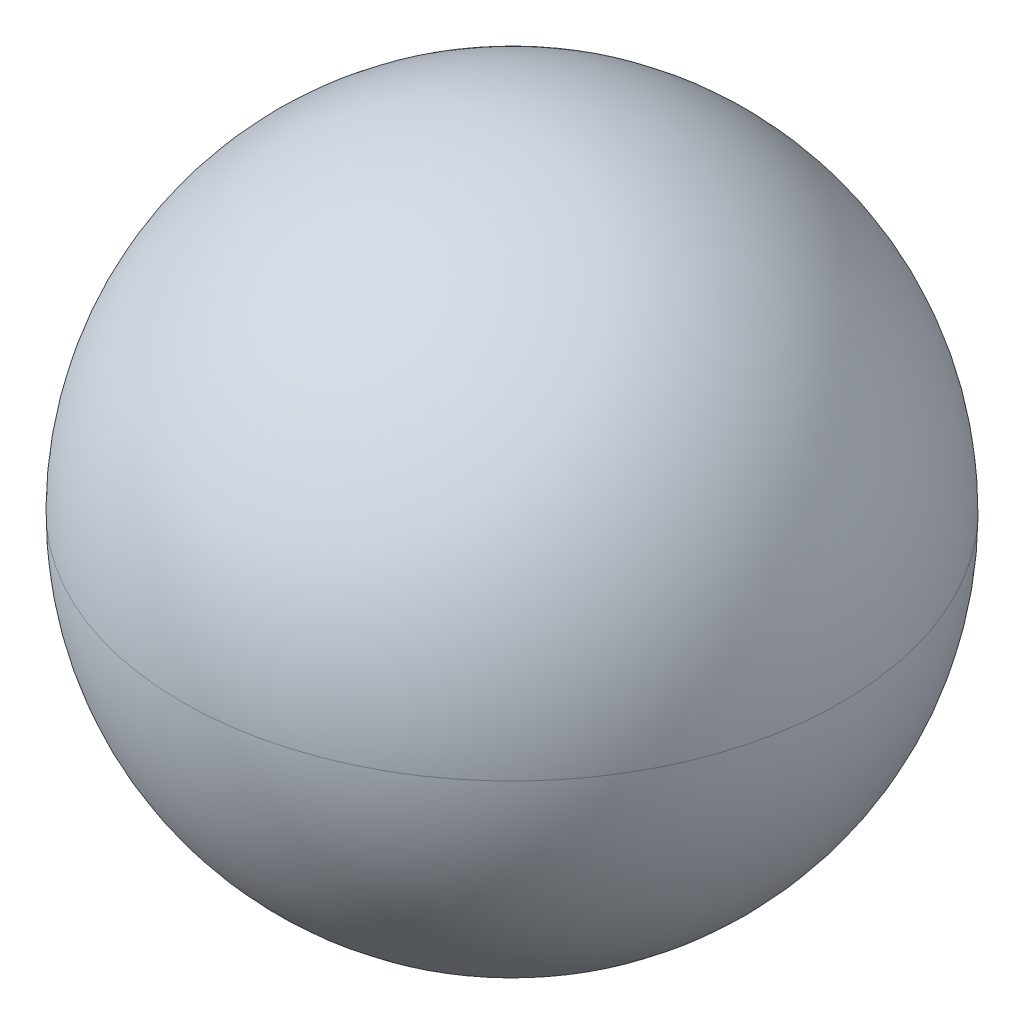
ISO-10303-21;
HEADER;
FILE_DESCRIPTION(('STEP AP214'),'2;1');
FILE_NAME('part.step','',(''),(''),'','','');
FILE_SCHEMA(('AUTOMOTIVE_DESIGN { 1 0 10303 214 1 1 1 1 }'));
ENDSEC;
DATA;
#1=APPLICATION_CONTEXT('core data for automotive mechanical design processes');
#2=APPLICATION_PROTOCOL_DEFINITION('international standard','automotive_design',2000,#1);
#3=PRODUCT_CONTEXT('',#1,'mechanical');
#4=PRODUCT('Part','Part','',(#3));
#5=PRODUCT_RELATED_PRODUCT_CATEGORY('part','',(#4));
#6=PRODUCT_DEFINITION_FORMATION('','',#4);
#7=PRODUCT_DEFINITION_CONTEXT('part definition',#1,'design');
#8=PRODUCT_DEFINITION('design','',#6,#7);
#9=PRODUCT_DEFINITION_SHAPE('','',#8);
#10=(LENGTH_UNIT() NAMED_UNIT(*) SI_UNIT(.MILLI.,.METRE.));
#11=(NAMED_UNIT(*) PLANE_ANGLE_UNIT() SI_UNIT($,.RADIAN.));
#12=(NAMED_UNIT(*) SI_UNIT($,.STERADIAN.) SOLID_ANGLE_UNIT());
#13=UNCERTAINTY_MEASURE_WITH_UNIT(LENGTH_MEASURE(1.E-05),#10,'distance_accuracy_value','');
#14=(GEOMETRIC_REPRESENTATION_CONTEXT(3) GLOBAL_UNCERTAINTY_ASSIGNED_CONTEXT((#13)) GLOBAL_UNIT_ASSIGNED_CONTEXT((#10,
#11,#12)) REPRESENTATION_CONTEXT('',''));
#15=CARTESIAN_POINT('',(0.,0.,0.));
#16=DIRECTION('',(0.,0.,1.));
#17=DIRECTION('',(1.,0.,0.));
#18=AXIS2_PLACEMENT_3D('',#15,#16,#17);
#19=CARTESIAN_POINT('',(0.,304.8,0.));
#20=DIRECTION('',(0.,1.,0.));
#21=DIRECTION('',(0.,0.,1.));
#22=AXIS2_PLACEMENT_3D('',#19,#20,#21);
#23=SPHERICAL_SURFACE('',#22,304.8);
#24=CARTESIAN_POINT('',(0.,304.8,0.));
#25=DIRECTION('',(0.,-1.,0.));
#26=DIRECTION('',(0.,0.,-1.));
#27=AXIS2_PLACEMENT_3D('',#24,#25,#26);
#28=CIRCLE('',#27,304.8);
#29=CARTESIAN_POINT('',(0.,304.8,-304.8));
#30=VERTEX_POINT('',#29);
#31=EDGE_CURVE('E49',#30,#30,#28,.T.);
#32=ORIENTED_EDGE('',*,*,#31,.F.);
#33=EDGE_LOOP('',(#32));
#34=FACE_BOUND('',#33,.T.);
#35=ADVANCED_FACE('F40',(#34),#23,.T.);
#36=CARTESIAN_POINT('',(0.,304.8,0.));
#37=DIRECTION('',(0.,1.,0.));
#38=DIRECTION('',(0.,0.,1.));
#39=AXIS2_PLACEMENT_3D('',#36,#37,#38);
#40=SPHERICAL_SURFACE('',#39,304.8);
#41=ORIENTED_EDGE('',*,*,#31,.T.);
#42=EDGE_LOOP('',(#41));
#43=FACE_BOUND('',#42,.T.);
#44=ADVANCED_FACE('F56',(#43),#40,.T.);
#45=CLOSED_SHELL('',(#35,#44));
#46=CARTESIAN_POINT('',(0.,304.8,0.));
#47=DIRECTION('',(0.,1.,0.));
#48=DIRECTION('',(0.,0.,1.));
#49=AXIS2_PLACEMENT_3D('',#46,#47,#48);
#50=SPHERICAL_SURFACE('',#49,301.625);
#51=CARTESIAN_POINT('',(0.,304.8,0.));
#52=DIRECTION('',(0.,1.,0.));
#53=DIRECTION('',(0.,0.,1.));
#54=AXIS2_PLACEMENT_3D('',#51,#52,#53);
#55=CIRCLE('',#54,301.625);
#56=CARTESIAN_POINT('',(0.,304.8,301.625));
#57=VERTEX_POINT('',#56);
#58=EDGE_CURVE('E10',#57,#57,#55,.F.);
#59=ORIENTED_EDGE('',*,*,#58,.T.);
#60=EDGE_LOOP('',(#59));
#61=FACE_BOUND('',#60,.T.);
#62=ADVANCED_FACE('F64',(#61),#50,.F.);
#63=CARTESIAN_POINT('',(0.,304.8,0.));
#64=DIRECTION('',(0.,1.,0.));
#65=DIRECTION('',(0.,0.,1.));
#66=AXIS2_PLACEMENT_3D('',#63,#64,#65);
#67=SPHERICAL_SURFACE('',#66,301.625);
#68=ORIENTED_EDGE('',*,*,#58,.F.);
#69=EDGE_LOOP('',(#68));
#70=FACE_BOUND('',#69,.T.);
#71=ADVANCED_FACE('F42',(#70),#67,.F.);
#72=CLOSED_SHELL('',(#62,#71));
#73=ORIENTED_CLOSED_SHELL('',*,#72,.T.);
#74=BREP_WITH_VOIDS('B2',#45,(#73));
#75=ADVANCED_BREP_SHAPE_REPRESENTATION('',(#18,#74),#14);
#76=SHAPE_DEFINITION_REPRESENTATION(#9,#75);
ENDSEC;
END-ISO-10303-21;
